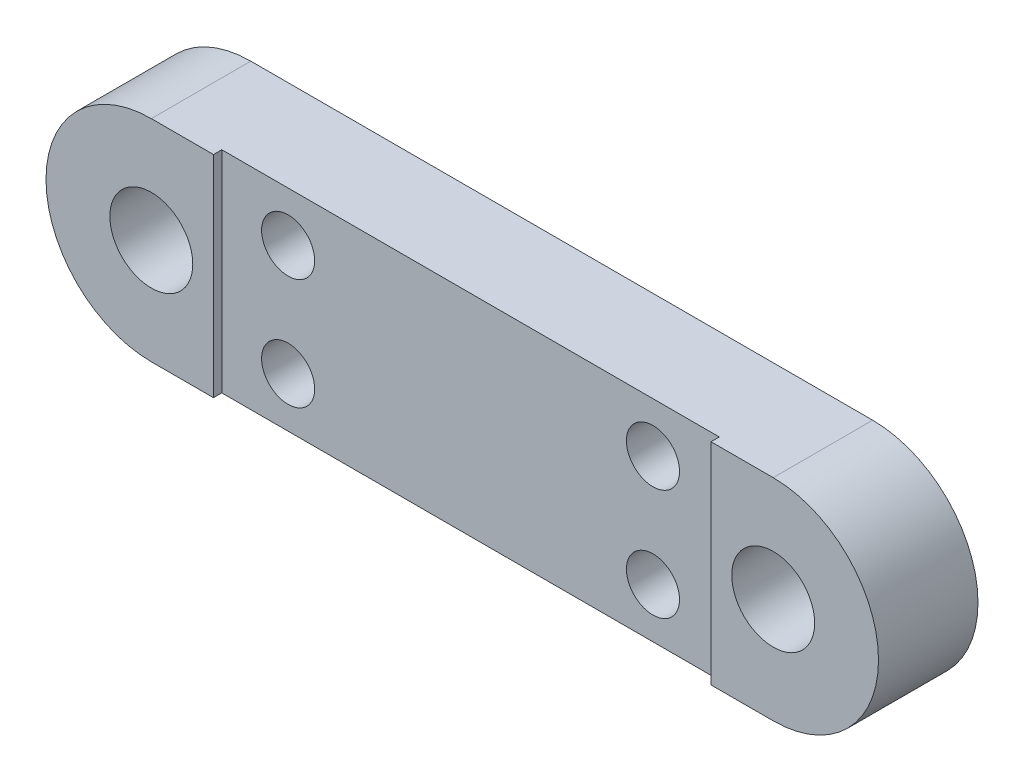
ISO-10303-21;
HEADER;
FILE_DESCRIPTION(('STEP AP214'),'2;1');
FILE_NAME('part.step','',(''),(''),'','','');
FILE_SCHEMA(('AUTOMOTIVE_DESIGN { 1 0 10303 214 1 1 1 1 }'));
ENDSEC;
DATA;
#1=APPLICATION_CONTEXT('core data for automotive mechanical design processes');
#2=APPLICATION_PROTOCOL_DEFINITION('international standard','automotive_design',2000,#1);
#3=PRODUCT_CONTEXT('',#1,'mechanical');
#4=PRODUCT('Part','Part','',(#3));
#5=PRODUCT_RELATED_PRODUCT_CATEGORY('part','',(#4));
#6=PRODUCT_DEFINITION_FORMATION('','',#4);
#7=PRODUCT_DEFINITION_CONTEXT('part definition',#1,'design');
#8=PRODUCT_DEFINITION('design','',#6,#7);
#9=PRODUCT_DEFINITION_SHAPE('','',#8);
#10=(LENGTH_UNIT() NAMED_UNIT(*) SI_UNIT(.MILLI.,.METRE.));
#11=(NAMED_UNIT(*) PLANE_ANGLE_UNIT() SI_UNIT($,.RADIAN.));
#12=(NAMED_UNIT(*) SI_UNIT($,.STERADIAN.) SOLID_ANGLE_UNIT());
#13=UNCERTAINTY_MEASURE_WITH_UNIT(LENGTH_MEASURE(1.E-05),#10,'distance_accuracy_value','');
#14=(GEOMETRIC_REPRESENTATION_CONTEXT(3) GLOBAL_UNCERTAINTY_ASSIGNED_CONTEXT((#13)) GLOBAL_UNIT_ASSIGNED_CONTEXT((#10,
#11,#12)) REPRESENTATION_CONTEXT('',''));
#15=CARTESIAN_POINT('',(0.,0.,0.));
#16=DIRECTION('',(0.,0.,1.));
#17=DIRECTION('',(1.,0.,0.));
#18=AXIS2_PLACEMENT_3D('',#15,#16,#17);
#19=CARTESIAN_POINT('',(0.,0.,12.));
#20=DIRECTION('',(0.,0.,1.));
#21=DIRECTION('',(1.,0.,0.));
#22=AXIS2_PLACEMENT_3D('',#19,#20,#21);
#23=PLANE('',#22);
#24=DIRECTION('',(0.,1.,0.));
#25=VECTOR('',#24,1.);
#26=CARTESIAN_POINT('',(67.5,-17.,12.));
#27=LINE('',#26,#25);
#28=CARTESIAN_POINT('',(67.5,-12.7,12.));
#29=VERTEX_POINT('',#28);
#30=CARTESIAN_POINT('',(67.5,12.7,12.));
#31=VERTEX_POINT('',#30);
#32=EDGE_CURVE('E114',#29,#31,#27,.T.);
#33=ORIENTED_EDGE('',*,*,#32,.F.);
#34=DIRECTION('',(1.,0.,0.));
#35=VECTOR('',#34,1.);
#36=CARTESIAN_POINT('',(0.,-12.7,12.));
#37=LINE('',#36,#35);
#38=CARTESIAN_POINT('',(75.,-12.7,12.));
#39=VERTEX_POINT('',#38);
#40=EDGE_CURVE('E123',#29,#39,#37,.T.);
#41=ORIENTED_EDGE('',*,*,#40,.T.);
#42=CARTESIAN_POINT('',(75.,0.,12.));
#43=DIRECTION('',(0.,0.,1.));
#44=DIRECTION('',(1.,0.,0.));
#45=AXIS2_PLACEMENT_3D('',#42,#43,#44);
#46=CIRCLE('',#45,12.7);
#47=CARTESIAN_POINT('',(75.,12.7,12.));
#48=VERTEX_POINT('',#47);
#49=EDGE_CURVE('E136',#39,#48,#46,.T.);
#50=ORIENTED_EDGE('',*,*,#49,.T.);
#51=DIRECTION('',(-1.,0.,0.));
#52=VECTOR('',#51,1.);
#53=CARTESIAN_POINT('',(0.,12.7,12.));
#54=LINE('',#53,#52);
#55=EDGE_CURVE('E126',#48,#31,#54,.T.);
#56=ORIENTED_EDGE('',*,*,#55,.T.);
#57=EDGE_LOOP('',(#33,#41,#50,#56));
#58=FACE_BOUND('',#57,.T.);
#59=CARTESIAN_POINT('',(75.,0.,12.));
#60=DIRECTION('',(0.,0.,1.));
#61=DIRECTION('',(1.,0.,0.));
#62=AXIS2_PLACEMENT_3D('',#59,#60,#61);
#63=CIRCLE('',#62,5.);
#64=CARTESIAN_POINT('',(80.,0.,12.));
#65=VERTEX_POINT('',#64);
#66=EDGE_CURVE('E245',#65,#65,#63,.T.);
#67=ORIENTED_EDGE('',*,*,#66,.F.);
#68=EDGE_LOOP('',(#67));
#69=FACE_BOUND('',#68,.T.);
#70=ADVANCED_FACE('F33',(#58,#69),#23,.T.);
#71=DIRECTION('',(0.,-1.,0.));
#72=VECTOR('',#71,1.);
#73=CARTESIAN_POINT('',(7.5,-17.,12.));
#74=LINE('',#73,#72);
#75=CARTESIAN_POINT('',(7.5,12.7,12.));
#76=VERTEX_POINT('',#75);
#77=CARTESIAN_POINT('',(7.5,-12.7,12.));
#78=VERTEX_POINT('',#77);
#79=EDGE_CURVE('E127',#76,#78,#74,.T.);
#80=ORIENTED_EDGE('',*,*,#79,.F.);
#81=CARTESIAN_POINT('',(0.,12.7,12.));
#82=VERTEX_POINT('',#81);
#83=EDGE_CURVE('E59',#76,#82,#54,.T.);
#84=ORIENTED_EDGE('',*,*,#83,.T.);
#85=CARTESIAN_POINT('',(0.,0.,12.));
#86=DIRECTION('',(0.,0.,1.));
#87=DIRECTION('',(1.,0.,0.));
#88=AXIS2_PLACEMENT_3D('',#85,#86,#87);
#89=CIRCLE('',#88,12.7);
#90=CARTESIAN_POINT('',(0.,-12.7,12.));
#91=VERTEX_POINT('',#90);
#92=EDGE_CURVE('E134',#82,#91,#89,.T.);
#93=ORIENTED_EDGE('',*,*,#92,.T.);
#94=EDGE_CURVE('E89',#91,#78,#37,.T.);
#95=ORIENTED_EDGE('',*,*,#94,.T.);
#96=EDGE_LOOP('',(#80,#84,#93,#95));
#97=FACE_BOUND('',#96,.T.);
#98=CARTESIAN_POINT('',(0.,0.,12.));
#99=DIRECTION('',(0.,0.,1.));
#100=DIRECTION('',(1.,0.,0.));
#101=AXIS2_PLACEMENT_3D('',#98,#99,#100);
#102=CIRCLE('',#101,5.);
#103=CARTESIAN_POINT('',(5.,0.,12.));
#104=VERTEX_POINT('',#103);
#105=EDGE_CURVE('E147',#104,#104,#102,.T.);
#106=ORIENTED_EDGE('',*,*,#105,.F.);
#107=EDGE_LOOP('',(#106));
#108=FACE_BOUND('',#107,.T.);
#109=ADVANCED_FACE('F192',(#97,#108),#23,.T.);
#110=CARTESIAN_POINT('',(0.,0.,0.));
#111=DIRECTION('',(0.,0.,1.));
#112=DIRECTION('',(1.,0.,0.));
#113=AXIS2_PLACEMENT_3D('',#110,#111,#112);
#114=PLANE('',#113);
#115=CARTESIAN_POINT('',(15.5000000000002,-6.69999999999586,0.));
#116=DIRECTION('',(0.,0.,1.));
#117=DIRECTION('',(1.,0.,0.));
#118=AXIS2_PLACEMENT_3D('',#115,#116,#117);
#119=CIRCLE('',#118,3.19999999999868);
#120=CARTESIAN_POINT('',(18.6999999999989,-6.69999999999586,0.));
#121=VERTEX_POINT('',#120);
#122=EDGE_CURVE('E302',#121,#121,#119,.T.);
#123=ORIENTED_EDGE('',*,*,#122,.T.);
#124=EDGE_LOOP('',(#123));
#125=FACE_BOUND('',#124,.T.);
#126=CARTESIAN_POINT('',(15.5000000000002,6.70000000000414,0.));
#127=DIRECTION('',(0.,0.,1.));
#128=DIRECTION('',(1.,0.,0.));
#129=AXIS2_PLACEMENT_3D('',#126,#127,#128);
#130=CIRCLE('',#129,3.19999999999868);
#131=CARTESIAN_POINT('',(18.6999999999989,6.70000000000414,0.));
#132=VERTEX_POINT('',#131);
#133=EDGE_CURVE('E299',#132,#132,#130,.T.);
#134=ORIENTED_EDGE('',*,*,#133,.T.);
#135=EDGE_LOOP('',(#134));
#136=FACE_BOUND('',#135,.T.);
#137=CARTESIAN_POINT('',(59.5000000000002,6.70000000000414,0.));
#138=DIRECTION('',(0.,0.,1.));
#139=DIRECTION('',(1.,0.,0.));
#140=AXIS2_PLACEMENT_3D('',#137,#138,#139);
#141=CIRCLE('',#140,3.19999999999867);
#142=CARTESIAN_POINT('',(62.6999999999989,6.70000000000414,0.));
#143=VERTEX_POINT('',#142);
#144=EDGE_CURVE('E297',#143,#143,#141,.T.);
#145=ORIENTED_EDGE('',*,*,#144,.T.);
#146=EDGE_LOOP('',(#145));
#147=FACE_BOUND('',#146,.T.);
#148=CARTESIAN_POINT('',(59.5000000000002,-6.69999999999586,0.));
#149=DIRECTION('',(0.,0.,1.));
#150=DIRECTION('',(1.,0.,0.));
#151=AXIS2_PLACEMENT_3D('',#148,#149,#150);
#152=CIRCLE('',#151,3.19999999999867);
#153=CARTESIAN_POINT('',(62.6999999999989,-6.69999999999586,0.));
#154=VERTEX_POINT('',#153);
#155=EDGE_CURVE('E167',#154,#154,#152,.T.);
#156=ORIENTED_EDGE('',*,*,#155,.T.);
#157=EDGE_LOOP('',(#156));
#158=FACE_BOUND('',#157,.T.);
#159=CARTESIAN_POINT('',(0.,0.,0.));
#160=DIRECTION('',(0.,0.,1.));
#161=DIRECTION('',(1.,0.,0.));
#162=AXIS2_PLACEMENT_3D('',#159,#160,#161);
#163=CIRCLE('',#162,5.);
#164=CARTESIAN_POINT('',(5.,0.,0.));
#165=VERTEX_POINT('',#164);
#166=EDGE_CURVE('E248',#165,#165,#163,.T.);
#167=ORIENTED_EDGE('',*,*,#166,.T.);
#168=EDGE_LOOP('',(#167));
#169=FACE_BOUND('',#168,.T.);
#170=CARTESIAN_POINT('',(0.,0.,0.));
#171=DIRECTION('',(0.,0.,1.));
#172=DIRECTION('',(1.,0.,0.));
#173=AXIS2_PLACEMENT_3D('',#170,#171,#172);
#174=CIRCLE('',#173,12.7);
#175=CARTESIAN_POINT('',(0.,12.7,0.));
#176=VERTEX_POINT('',#175);
#177=CARTESIAN_POINT('',(0.,-12.7,0.));
#178=VERTEX_POINT('',#177);
#179=EDGE_CURVE('E143',#176,#178,#174,.T.);
#180=ORIENTED_EDGE('',*,*,#179,.F.);
#181=DIRECTION('',(-1.,0.,0.));
#182=VECTOR('',#181,1.);
#183=CARTESIAN_POINT('',(0.,12.7,0.));
#184=LINE('',#183,#182);
#185=CARTESIAN_POINT('',(75.,12.7,0.));
#186=VERTEX_POINT('',#185);
#187=EDGE_CURVE('E81',#186,#176,#184,.T.);
#188=ORIENTED_EDGE('',*,*,#187,.F.);
#189=CARTESIAN_POINT('',(75.,0.,0.));
#190=DIRECTION('',(0.,0.,1.));
#191=DIRECTION('',(1.,0.,0.));
#192=AXIS2_PLACEMENT_3D('',#189,#190,#191);
#193=CIRCLE('',#192,12.7);
#194=CARTESIAN_POINT('',(75.,-12.7,0.));
#195=VERTEX_POINT('',#194);
#196=EDGE_CURVE('E149',#195,#186,#193,.T.);
#197=ORIENTED_EDGE('',*,*,#196,.F.);
#198=DIRECTION('',(1.,0.,0.));
#199=VECTOR('',#198,1.);
#200=CARTESIAN_POINT('',(0.,-12.7,0.));
#201=LINE('',#200,#199);
#202=EDGE_CURVE('E146',#178,#195,#201,.T.);
#203=ORIENTED_EDGE('',*,*,#202,.F.);
#204=EDGE_LOOP('',(#180,#188,#197,#203));
#205=FACE_BOUND('',#204,.T.);
#206=CARTESIAN_POINT('',(75.,0.,0.));
#207=DIRECTION('',(0.,0.,1.));
#208=DIRECTION('',(1.,0.,0.));
#209=AXIS2_PLACEMENT_3D('',#206,#207,#208);
#210=CIRCLE('',#209,5.);
#211=CARTESIAN_POINT('',(80.,0.,0.));
#212=VERTEX_POINT('',#211);
#213=EDGE_CURVE('E242',#212,#212,#210,.T.);
#214=ORIENTED_EDGE('',*,*,#213,.T.);
#215=EDGE_LOOP('',(#214));
#216=FACE_BOUND('',#215,.T.);
#217=ADVANCED_FACE('F197',(#125,#136,#147,#158,#169,#205,#216),#114,.F.);
#218=CARTESIAN_POINT('',(0.,0.,12.));
#219=DIRECTION('',(0.,0.,-1.));
#220=DIRECTION('',(-1.,0.,0.));
#221=AXIS2_PLACEMENT_3D('',#218,#219,#220);
#222=CYLINDRICAL_SURFACE('',#221,12.7);
#223=ORIENTED_EDGE('',*,*,#179,.T.);
#224=DIRECTION('',(0.,0.,-1.));
#225=VECTOR('',#224,1.);
#226=CARTESIAN_POINT('',(0.,-12.7,12.));
#227=LINE('',#226,#225);
#228=EDGE_CURVE('E156',#91,#178,#227,.T.);
#229=ORIENTED_EDGE('',*,*,#228,.F.);
#230=ORIENTED_EDGE('',*,*,#92,.F.);
#231=DIRECTION('',(0.,0.,-1.));
#232=VECTOR('',#231,1.);
#233=CARTESIAN_POINT('',(0.,12.7,12.));
#234=LINE('',#233,#232);
#235=EDGE_CURVE('E142',#82,#176,#234,.T.);
#236=ORIENTED_EDGE('',*,*,#235,.T.);
#237=EDGE_LOOP('',(#223,#229,#230,#236));
#238=FACE_BOUND('',#237,.T.);
#239=ADVANCED_FACE('F35',(#238),#222,.T.);
#240=CARTESIAN_POINT('',(0.,-12.7,12.));
#241=DIRECTION('',(0.,1.,0.));
#242=DIRECTION('',(0.,0.,1.));
#243=AXIS2_PLACEMENT_3D('',#240,#241,#242);
#244=PLANE('',#243);
#245=ORIENTED_EDGE('',*,*,#40,.F.);
#246=DIRECTION('',(0.,0.,-1.));
#247=VECTOR('',#246,1.);
#248=CARTESIAN_POINT('',(67.5,-12.7,12.));
#249=LINE('',#248,#247);
#250=CARTESIAN_POINT('',(67.5,-12.7,11.));
#251=VERTEX_POINT('',#250);
#252=EDGE_CURVE('E111',#29,#251,#249,.T.);
#253=ORIENTED_EDGE('',*,*,#252,.T.);
#254=DIRECTION('',(-1.,0.,0.));
#255=VECTOR('',#254,1.);
#256=CARTESIAN_POINT('',(0.,-12.7,11.));
#257=LINE('',#256,#255);
#258=CARTESIAN_POINT('',(7.5,-12.7,11.));
#259=VERTEX_POINT('',#258);
#260=EDGE_CURVE('E231',#251,#259,#257,.T.);
#261=ORIENTED_EDGE('',*,*,#260,.T.);
#262=DIRECTION('',(0.,0.,1.));
#263=VECTOR('',#262,1.);
#264=CARTESIAN_POINT('',(7.5,-12.7,12.));
#265=LINE('',#264,#263);
#266=EDGE_CURVE('E118',#259,#78,#265,.T.);
#267=ORIENTED_EDGE('',*,*,#266,.T.);
#268=ORIENTED_EDGE('',*,*,#94,.F.);
#269=ORIENTED_EDGE('',*,*,#228,.T.);
#270=ORIENTED_EDGE('',*,*,#202,.T.);
#271=DIRECTION('',(0.,0.,-1.));
#272=VECTOR('',#271,1.);
#273=CARTESIAN_POINT('',(75.,-12.7,12.));
#274=LINE('',#273,#272);
#275=EDGE_CURVE('E132',#39,#195,#274,.T.);
#276=ORIENTED_EDGE('',*,*,#275,.F.);
#277=EDGE_LOOP('',(#245,#253,#261,#267,#268,#269,#270,#276));
#278=FACE_BOUND('',#277,.T.);
#279=CARTESIAN_POINT('',(37.5,-12.7,6.));
#280=DIRECTION('',(0.,-1.,0.));
#281=DIRECTION('',(0.,0.,-1.));
#282=AXIS2_PLACEMENT_3D('',#279,#280,#281);
#283=CIRCLE('',#282,4.);
#284=CARTESIAN_POINT('',(37.5,-12.7,2.));
#285=VERTEX_POINT('',#284);
#286=EDGE_CURVE('E117',#285,#285,#283,.T.);
#287=ORIENTED_EDGE('',*,*,#286,.F.);
#288=EDGE_LOOP('',(#287));
#289=FACE_BOUND('',#288,.T.);
#290=ADVANCED_FACE('F129',(#278,#289),#244,.F.);
#291=CARTESIAN_POINT('',(75.,0.,12.));
#292=DIRECTION('',(0.,0.,-1.));
#293=DIRECTION('',(-1.,0.,0.));
#294=AXIS2_PLACEMENT_3D('',#291,#292,#293);
#295=CYLINDRICAL_SURFACE('',#294,12.7);
#296=ORIENTED_EDGE('',*,*,#196,.T.);
#297=DIRECTION('',(0.,0.,-1.));
#298=VECTOR('',#297,1.);
#299=CARTESIAN_POINT('',(75.,12.7,12.));
#300=LINE('',#299,#298);
#301=EDGE_CURVE('E153',#48,#186,#300,.T.);
#302=ORIENTED_EDGE('',*,*,#301,.F.);
#303=ORIENTED_EDGE('',*,*,#49,.F.);
#304=ORIENTED_EDGE('',*,*,#275,.T.);
#305=EDGE_LOOP('',(#296,#302,#303,#304));
#306=FACE_BOUND('',#305,.T.);
#307=ADVANCED_FACE('F208',(#306),#295,.T.);
#308=CARTESIAN_POINT('',(0.,12.7,12.));
#309=DIRECTION('',(0.,-1.,0.));
#310=DIRECTION('',(0.,0.,-1.));
#311=AXIS2_PLACEMENT_3D('',#308,#309,#310);
#312=PLANE('',#311);
#313=DIRECTION('',(1.,0.,0.));
#314=VECTOR('',#313,1.);
#315=CARTESIAN_POINT('',(0.,12.7,11.));
#316=LINE('',#315,#314);
#317=CARTESIAN_POINT('',(7.5,12.7,11.));
#318=VERTEX_POINT('',#317);
#319=CARTESIAN_POINT('',(67.5,12.7,11.));
#320=VERTEX_POINT('',#319);
#321=EDGE_CURVE('E158',#318,#320,#316,.T.);
#322=ORIENTED_EDGE('',*,*,#321,.T.);
#323=DIRECTION('',(0.,0.,1.));
#324=VECTOR('',#323,1.);
#325=CARTESIAN_POINT('',(67.5,12.7,12.));
#326=LINE('',#325,#324);
#327=EDGE_CURVE('E11',#320,#31,#326,.T.);
#328=ORIENTED_EDGE('',*,*,#327,.T.);
#329=ORIENTED_EDGE('',*,*,#55,.F.);
#330=ORIENTED_EDGE('',*,*,#301,.T.);
#331=ORIENTED_EDGE('',*,*,#187,.T.);
#332=ORIENTED_EDGE('',*,*,#235,.F.);
#333=ORIENTED_EDGE('',*,*,#83,.F.);
#334=DIRECTION('',(0.,0.,-1.));
#335=VECTOR('',#334,1.);
#336=CARTESIAN_POINT('',(7.5,12.7,12.));
#337=LINE('',#336,#335);
#338=EDGE_CURVE('E42',#76,#318,#337,.T.);
#339=ORIENTED_EDGE('',*,*,#338,.T.);
#340=EDGE_LOOP('',(#322,#328,#329,#330,#331,#332,#333,#339));
#341=FACE_BOUND('',#340,.T.);
#342=ADVANCED_FACE('F205',(#341),#312,.F.);
#343=CARTESIAN_POINT('',(0.,0.,12.));
#344=DIRECTION('',(0.,0.,-1.));
#345=DIRECTION('',(-1.,0.,0.));
#346=AXIS2_PLACEMENT_3D('',#343,#344,#345);
#347=CYLINDRICAL_SURFACE('',#346,5.);
#348=ORIENTED_EDGE('',*,*,#105,.T.);
#349=EDGE_LOOP('',(#348));
#350=FACE_BOUND('',#349,.T.);
#351=ORIENTED_EDGE('',*,*,#166,.F.);
#352=EDGE_LOOP('',(#351));
#353=FACE_BOUND('',#352,.T.);
#354=ADVANCED_FACE('F200',(#350,#353),#347,.F.);
#355=CARTESIAN_POINT('',(75.,0.,12.));
#356=DIRECTION('',(0.,0.,-1.));
#357=DIRECTION('',(-1.,0.,0.));
#358=AXIS2_PLACEMENT_3D('',#355,#356,#357);
#359=CYLINDRICAL_SURFACE('',#358,5.);
#360=ORIENTED_EDGE('',*,*,#66,.T.);
#361=EDGE_LOOP('',(#360));
#362=FACE_BOUND('',#361,.T.);
#363=ORIENTED_EDGE('',*,*,#213,.F.);
#364=EDGE_LOOP('',(#363));
#365=FACE_BOUND('',#364,.T.);
#366=ADVANCED_FACE('F257',(#362,#365),#359,.F.);
#367=CARTESIAN_POINT('',(37.5,8.3,6.));
#368=DIRECTION('',(0.,-1.,0.));
#369=DIRECTION('',(0.,0.,-1.));
#370=AXIS2_PLACEMENT_3D('',#367,#368,#369);
#371=CYLINDRICAL_SURFACE('',#370,4.);
#372=CARTESIAN_POINT('',(37.5,8.3,6.));
#373=DIRECTION('',(0.,-1.,0.));
#374=DIRECTION('',(0.,0.,-1.));
#375=AXIS2_PLACEMENT_3D('',#372,#373,#374);
#376=CIRCLE('',#375,4.);
#377=CARTESIAN_POINT('',(37.5,8.3,2.));
#378=VERTEX_POINT('',#377);
#379=EDGE_CURVE('E239',#378,#378,#376,.T.);
#380=CARTESIAN_POINT('',(37.5,8.3,2.));
#381=CARTESIAN_POINT('',(37.5,8.08125,2.));
#382=CARTESIAN_POINT('',(37.5,7.8625,2.));
#383=CARTESIAN_POINT('',(37.5,7.425,2.));
#384=CARTESIAN_POINT('',(37.5,7.20625,2.));
#385=CARTESIAN_POINT('',(37.5,6.76875,2.));
#386=CARTESIAN_POINT('',(37.5,6.55,2.));
#387=CARTESIAN_POINT('',(37.5,6.1125,2.));
#388=CARTESIAN_POINT('',(37.5,5.89375,2.));
#389=CARTESIAN_POINT('',(37.5,5.45625,2.));
#390=CARTESIAN_POINT('',(37.5,5.2375,2.));
#391=CARTESIAN_POINT('',(37.5,4.8,2.));
#392=CARTESIAN_POINT('',(37.5,4.58125,2.));
#393=CARTESIAN_POINT('',(37.5,4.14375,2.));
#394=CARTESIAN_POINT('',(37.5,3.925,2.));
#395=CARTESIAN_POINT('',(37.5,3.4875,2.));
#396=CARTESIAN_POINT('',(37.5,3.26875,2.));
#397=CARTESIAN_POINT('',(37.5,2.83125,2.));
#398=CARTESIAN_POINT('',(37.5,2.6125,2.));
#399=CARTESIAN_POINT('',(37.5,2.175,2.));
#400=CARTESIAN_POINT('',(37.5,1.95625,2.));
#401=CARTESIAN_POINT('',(37.5,1.51875,2.));
#402=CARTESIAN_POINT('',(37.5,1.3,2.));
#403=CARTESIAN_POINT('',(37.5,0.862500000000002,2.));
#404=CARTESIAN_POINT('',(37.5,0.643750000000002,2.));
#405=CARTESIAN_POINT('',(37.5,0.206250000000002,2.));
#406=CARTESIAN_POINT('',(37.5,-0.0124999999999986,2.));
#407=CARTESIAN_POINT('',(37.5,-0.449999999999998,2.));
#408=CARTESIAN_POINT('',(37.5,-0.668749999999998,2.));
#409=CARTESIAN_POINT('',(37.5,-1.10625,2.));
#410=CARTESIAN_POINT('',(37.5,-1.325,2.));
#411=CARTESIAN_POINT('',(37.5,-1.7625,2.));
#412=CARTESIAN_POINT('',(37.5,-1.98125,2.));
#413=CARTESIAN_POINT('',(37.5,-2.41875,2.));
#414=CARTESIAN_POINT('',(37.5,-2.6375,2.));
#415=CARTESIAN_POINT('',(37.5,-3.075,2.));
#416=CARTESIAN_POINT('',(37.5,-3.29375,2.));
#417=CARTESIAN_POINT('',(37.5,-3.73125,2.));
#418=CARTESIAN_POINT('',(37.5,-3.95,2.));
#419=CARTESIAN_POINT('',(37.5,-4.3875,2.));
#420=CARTESIAN_POINT('',(37.5,-4.60625,2.));
#421=CARTESIAN_POINT('',(37.5,-5.04375,2.));
#422=CARTESIAN_POINT('',(37.5,-5.2625,2.));
#423=CARTESIAN_POINT('',(37.5,-5.7,2.));
#424=CARTESIAN_POINT('',(37.5,-5.91875,2.));
#425=CARTESIAN_POINT('',(37.5,-6.35625,2.));
#426=CARTESIAN_POINT('',(37.5,-6.575,2.));
#427=CARTESIAN_POINT('',(37.5,-7.0125,2.));
#428=CARTESIAN_POINT('',(37.5,-7.23125,2.));
#429=CARTESIAN_POINT('',(37.5,-7.66875,2.));
#430=CARTESIAN_POINT('',(37.5,-7.8875,2.));
#431=CARTESIAN_POINT('',(37.5,-8.325,2.));
#432=CARTESIAN_POINT('',(37.5,-8.54375,2.));
#433=CARTESIAN_POINT('',(37.5,-8.98125,2.));
#434=CARTESIAN_POINT('',(37.5,-9.2,2.));
#435=CARTESIAN_POINT('',(37.5,-9.6375,2.));
#436=CARTESIAN_POINT('',(37.5,-9.85625,2.));
#437=CARTESIAN_POINT('',(37.5,-10.29375,2.));
#438=CARTESIAN_POINT('',(37.5,-10.5125,2.));
#439=CARTESIAN_POINT('',(37.5,-10.95,2.));
#440=CARTESIAN_POINT('',(37.5,-11.16875,2.));
#441=CARTESIAN_POINT('',(37.5,-11.60625,2.));
#442=CARTESIAN_POINT('',(37.5,-11.825,2.));
#443=CARTESIAN_POINT('',(37.5,-12.2625,2.));
#444=CARTESIAN_POINT('',(37.5,-12.48125,2.));
#445=CARTESIAN_POINT('',(37.5,-12.7,2.));
#446=B_SPLINE_CURVE_WITH_KNOTS('',3,(#380,#381,#382,#383,#384,#385,#386,#387,#388,#389,#390,
#391,#392,#393,#394,#395,#396,#397,#398,#399,#400,#401,#402,#403,#404,#405,#406,#407,#408,#409,
#410,#411,#412,#413,#414,#415,#416,#417,#418,#419,#420,#421,#422,#423,#424,#425,#426,#427,#428,
#429,#430,#431,#432,#433,#434,#435,#436,#437,#438,#439,#440,#441,#442,#443,#444,#445),
.UNSPECIFIED.,.F.,.F.,(4,2,2,2,2,2,2,2,2,2,2,2,2,2,2,2,2,2,2,2,2,2,2,2,2,2,2,2,2,2,2,2,4),(0.,
0.656249999999999,1.3125,1.96875,2.625,3.28125,3.9375,4.59375,5.25,5.90625,6.5625,7.21875,7.875,
8.53125,9.1875,9.84375,10.5,11.15625,11.8125,12.46875,13.125,13.78125,14.4375,15.09375,15.75,
16.40625,17.0625,17.71875,18.375,19.03125,19.6875,20.34375,21.),.UNSPECIFIED.);
#447=EDGE_CURVE('BSEAM262',#378,#285,#446,.T.);
#448=ORIENTED_EDGE('',*,*,#379,.F.);
#449=ORIENTED_EDGE('',*,*,#286,.T.);
#450=ORIENTED_EDGE('',*,*,#447,.T.);
#451=ORIENTED_EDGE('',*,*,#447,.F.);
#452=EDGE_LOOP('',(#448,#450,#449,#451));
#453=FACE_BOUND('',#452,.T.);
#454=ADVANCED_FACE('F262',(#453),#371,.F.);
#455=CARTESIAN_POINT('',(37.5,8.3,6.));
#456=DIRECTION('',(0.,-1.,0.));
#457=DIRECTION('',(0.,0.,-1.));
#458=AXIS2_PLACEMENT_3D('',#455,#456,#457);
#459=PLANE('',#458);
#460=ORIENTED_EDGE('',*,*,#379,.T.);
#461=EDGE_LOOP('',(#460));
#462=FACE_BOUND('',#461,.T.);
#463=ADVANCED_FACE('F269',(#462),#459,.T.);
#464=CARTESIAN_POINT('',(67.5,-17.,11.));
#465=DIRECTION('',(1.,0.,0.));
#466=DIRECTION('',(0.,0.,-1.));
#467=AXIS2_PLACEMENT_3D('',#464,#465,#466);
#468=PLANE('',#467);
#469=ORIENTED_EDGE('',*,*,#32,.T.);
#470=ORIENTED_EDGE('',*,*,#327,.F.);
#471=DIRECTION('',(0.,1.,0.));
#472=VECTOR('',#471,1.);
#473=CARTESIAN_POINT('',(67.5,-17.,11.));
#474=LINE('',#473,#472);
#475=EDGE_CURVE('E50',#251,#320,#474,.T.);
#476=ORIENTED_EDGE('',*,*,#475,.F.);
#477=ORIENTED_EDGE('',*,*,#252,.F.);
#478=EDGE_LOOP('',(#469,#470,#476,#477));
#479=FACE_BOUND('',#478,.T.);
#480=ADVANCED_FACE('F113',(#479),#468,.F.);
#481=CARTESIAN_POINT('',(7.5,-17.,11.));
#482=DIRECTION('',(-1.,0.,0.));
#483=DIRECTION('',(0.,0.,1.));
#484=AXIS2_PLACEMENT_3D('',#481,#482,#483);
#485=PLANE('',#484);
#486=DIRECTION('',(0.,-1.,0.));
#487=VECTOR('',#486,1.);
#488=CARTESIAN_POINT('',(7.5,-17.,11.));
#489=LINE('',#488,#487);
#490=EDGE_CURVE('E228',#318,#259,#489,.T.);
#491=ORIENTED_EDGE('',*,*,#490,.F.);
#492=ORIENTED_EDGE('',*,*,#338,.F.);
#493=ORIENTED_EDGE('',*,*,#79,.T.);
#494=ORIENTED_EDGE('',*,*,#266,.F.);
#495=EDGE_LOOP('',(#491,#492,#493,#494));
#496=FACE_BOUND('',#495,.T.);
#497=ADVANCED_FACE('F230',(#496),#485,.F.);
#498=CARTESIAN_POINT('',(0.,0.,11.));
#499=DIRECTION('',(0.,0.,-1.));
#500=DIRECTION('',(-1.,0.,0.));
#501=AXIS2_PLACEMENT_3D('',#498,#499,#500);
#502=PLANE('',#501);
#503=CARTESIAN_POINT('',(15.5000000000002,-6.69999999999586,11.));
#504=DIRECTION('',(0.,0.,-1.));
#505=DIRECTION('',(-1.,0.,0.));
#506=AXIS2_PLACEMENT_3D('',#503,#504,#505);
#507=CIRCLE('',#506,3.19999999999868);
#508=CARTESIAN_POINT('',(12.3000000000015,-6.69999999999586,11.));
#509=VERTEX_POINT('',#508);
#510=EDGE_CURVE('E37',#509,#509,#507,.T.);
#511=ORIENTED_EDGE('',*,*,#510,.T.);
#512=EDGE_LOOP('',(#511));
#513=FACE_BOUND('',#512,.T.);
#514=CARTESIAN_POINT('',(15.5000000000002,6.70000000000414,11.));
#515=DIRECTION('',(0.,0.,-1.));
#516=DIRECTION('',(-1.,0.,0.));
#517=AXIS2_PLACEMENT_3D('',#514,#515,#516);
#518=CIRCLE('',#517,3.19999999999868);
#519=CARTESIAN_POINT('',(12.3000000000015,6.70000000000414,11.));
#520=VERTEX_POINT('',#519);
#521=EDGE_CURVE('E169',#520,#520,#518,.T.);
#522=ORIENTED_EDGE('',*,*,#521,.T.);
#523=EDGE_LOOP('',(#522));
#524=FACE_BOUND('',#523,.T.);
#525=CARTESIAN_POINT('',(59.5000000000002,6.70000000000414,11.));
#526=DIRECTION('',(0.,0.,-1.));
#527=DIRECTION('',(-1.,0.,0.));
#528=AXIS2_PLACEMENT_3D('',#525,#526,#527);
#529=CIRCLE('',#528,3.19999999999867);
#530=CARTESIAN_POINT('',(56.3000000000015,6.70000000000414,11.));
#531=VERTEX_POINT('',#530);
#532=EDGE_CURVE('E166',#531,#531,#529,.T.);
#533=ORIENTED_EDGE('',*,*,#532,.T.);
#534=EDGE_LOOP('',(#533));
#535=FACE_BOUND('',#534,.T.);
#536=CARTESIAN_POINT('',(59.5000000000002,-6.69999999999586,11.));
#537=DIRECTION('',(0.,0.,-1.));
#538=DIRECTION('',(-1.,0.,0.));
#539=AXIS2_PLACEMENT_3D('',#536,#537,#538);
#540=CIRCLE('',#539,3.19999999999867);
#541=CARTESIAN_POINT('',(56.3000000000015,-6.69999999999586,11.));
#542=VERTEX_POINT('',#541);
#543=EDGE_CURVE('E163',#542,#542,#540,.T.);
#544=ORIENTED_EDGE('',*,*,#543,.T.);
#545=EDGE_LOOP('',(#544));
#546=FACE_BOUND('',#545,.T.);
#547=ORIENTED_EDGE('',*,*,#475,.T.);
#548=ORIENTED_EDGE('',*,*,#321,.F.);
#549=ORIENTED_EDGE('',*,*,#490,.T.);
#550=ORIENTED_EDGE('',*,*,#260,.F.);
#551=EDGE_LOOP('',(#547,#548,#549,#550));
#552=FACE_BOUND('',#551,.T.);
#553=ADVANCED_FACE('F176',(#513,#524,#535,#546,#552),#502,.F.);
#554=CARTESIAN_POINT('',(59.5000000000002,-6.69999999999586,0.));
#555=DIRECTION('',(0.,0.,1.));
#556=DIRECTION('',(1.,0.,0.));
#557=AXIS2_PLACEMENT_3D('',#554,#555,#556);
#558=CYLINDRICAL_SURFACE('',#557,3.19999999999867);
#559=ORIENTED_EDGE('',*,*,#155,.F.);
#560=EDGE_LOOP('',(#559));
#561=FACE_BOUND('',#560,.T.);
#562=ORIENTED_EDGE('',*,*,#543,.F.);
#563=EDGE_LOOP('',(#562));
#564=FACE_BOUND('',#563,.T.);
#565=ADVANCED_FACE('F282',(#561,#564),#558,.F.);
#566=CARTESIAN_POINT('',(59.5000000000002,6.70000000000414,0.));
#567=DIRECTION('',(0.,0.,1.));
#568=DIRECTION('',(1.,0.,0.));
#569=AXIS2_PLACEMENT_3D('',#566,#567,#568);
#570=CYLINDRICAL_SURFACE('',#569,3.19999999999867);
#571=ORIENTED_EDGE('',*,*,#144,.F.);
#572=EDGE_LOOP('',(#571));
#573=FACE_BOUND('',#572,.T.);
#574=ORIENTED_EDGE('',*,*,#532,.F.);
#575=EDGE_LOOP('',(#574));
#576=FACE_BOUND('',#575,.T.);
#577=ADVANCED_FACE('F186',(#573,#576),#570,.F.);
#578=CARTESIAN_POINT('',(15.5000000000002,6.70000000000414,0.));
#579=DIRECTION('',(0.,0.,1.));
#580=DIRECTION('',(1.,0.,0.));
#581=AXIS2_PLACEMENT_3D('',#578,#579,#580);
#582=CYLINDRICAL_SURFACE('',#581,3.19999999999868);
#583=ORIENTED_EDGE('',*,*,#133,.F.);
#584=EDGE_LOOP('',(#583));
#585=FACE_BOUND('',#584,.T.);
#586=ORIENTED_EDGE('',*,*,#521,.F.);
#587=EDGE_LOOP('',(#586));
#588=FACE_BOUND('',#587,.T.);
#589=ADVANCED_FACE('F180',(#585,#588),#582,.F.);
#590=CARTESIAN_POINT('',(15.5000000000002,-6.69999999999586,0.));
#591=DIRECTION('',(0.,0.,1.));
#592=DIRECTION('',(1.,0.,0.));
#593=AXIS2_PLACEMENT_3D('',#590,#591,#592);
#594=CYLINDRICAL_SURFACE('',#593,3.19999999999868);
#595=ORIENTED_EDGE('',*,*,#122,.F.);
#596=EDGE_LOOP('',(#595));
#597=FACE_BOUND('',#596,.T.);
#598=ORIENTED_EDGE('',*,*,#510,.F.);
#599=EDGE_LOOP('',(#598));
#600=FACE_BOUND('',#599,.T.);
#601=ADVANCED_FACE('F178',(#597,#600),#594,.F.);
#602=CLOSED_SHELL('',(#70,#109,#217,#239,#290,#307,#342,#354,#366,#454,#463,#480,#497,#553,#565,
#577,#589,#601));
#603=MANIFOLD_SOLID_BREP('B2',#602);
#604=ADVANCED_BREP_SHAPE_REPRESENTATION('',(#18,#603),#14);
#605=SHAPE_DEFINITION_REPRESENTATION(#9,#604);
ENDSEC;
END-ISO-10303-21;
